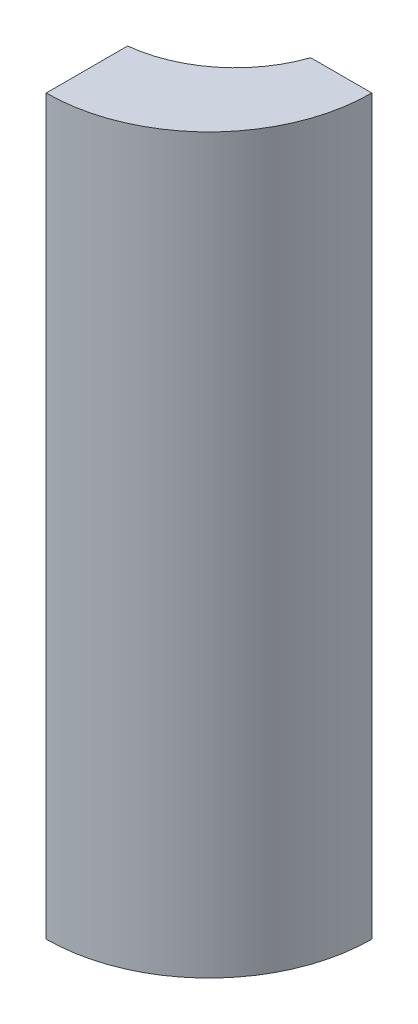
ISO-10303-21;
HEADER;
FILE_DESCRIPTION(('STEP AP214'),'2;1');
FILE_NAME('part.step','',(''),(''),'','','');
FILE_SCHEMA(('AUTOMOTIVE_DESIGN { 1 0 10303 214 1 1 1 1 }'));
ENDSEC;
DATA;
#1=APPLICATION_CONTEXT('core data for automotive mechanical design processes');
#2=APPLICATION_PROTOCOL_DEFINITION('international standard','automotive_design',2000,#1);
#3=PRODUCT_CONTEXT('',#1,'mechanical');
#4=PRODUCT('Part','Part','',(#3));
#5=PRODUCT_RELATED_PRODUCT_CATEGORY('part','',(#4));
#6=PRODUCT_DEFINITION_FORMATION('','',#4);
#7=PRODUCT_DEFINITION_CONTEXT('part definition',#1,'design');
#8=PRODUCT_DEFINITION('design','',#6,#7);
#9=PRODUCT_DEFINITION_SHAPE('','',#8);
#10=(LENGTH_UNIT() NAMED_UNIT(*) SI_UNIT(.MILLI.,.METRE.));
#11=(NAMED_UNIT(*) PLANE_ANGLE_UNIT() SI_UNIT($,.RADIAN.));
#12=(NAMED_UNIT(*) SI_UNIT($,.STERADIAN.) SOLID_ANGLE_UNIT());
#13=UNCERTAINTY_MEASURE_WITH_UNIT(LENGTH_MEASURE(1.E-05),#10,'distance_accuracy_value','');
#14=(GEOMETRIC_REPRESENTATION_CONTEXT(3) GLOBAL_UNCERTAINTY_ASSIGNED_CONTEXT((#13)) GLOBAL_UNIT_ASSIGNED_CONTEXT((#10,
#11,#12)) REPRESENTATION_CONTEXT('',''));
#15=CARTESIAN_POINT('',(0.,0.,0.));
#16=DIRECTION('',(0.,0.,1.));
#17=DIRECTION('',(1.,0.,0.));
#18=AXIS2_PLACEMENT_3D('',#15,#16,#17);
#19=CARTESIAN_POINT('',(-127.,57.15,12.7));
#20=DIRECTION('',(0.,-1.,0.));
#21=DIRECTION('',(0.,0.,-1.));
#22=AXIS2_PLACEMENT_3D('',#19,#20,#21);
#23=PLANE('',#22);
#24=CARTESIAN_POINT('',(124.872809850528,57.15,-18.93086268684));
#25=DIRECTION('',(0.,-1.,0.));
#26=DIRECTION('',(0.,0.,-1.));
#27=AXIS2_PLACEMENT_3D('',#24,#25,#26);
#28=CIRCLE('',#27,19.05);
#29=CARTESIAN_POINT('',(142.875,57.15,-12.7));
#30=VERTEX_POINT('',#29);
#31=CARTESIAN_POINT('',(127.,57.15,0.));
#32=VERTEX_POINT('',#31);
#33=EDGE_CURVE('E86',#30,#32,#28,.T.);
#34=ORIENTED_EDGE('',*,*,#33,.T.);
#35=DIRECTION('',(0.,0.,-1.));
#36=VECTOR('',#35,1.);
#37=CARTESIAN_POINT('',(127.,57.15,12.7));
#38=LINE('',#37,#36);
#39=CARTESIAN_POINT('',(127.,57.15,12.7));
#40=VERTEX_POINT('',#39);
#41=EDGE_CURVE('E75',#40,#32,#38,.T.);
#42=ORIENTED_EDGE('',*,*,#41,.F.);
#43=CARTESIAN_POINT('',(127.,57.15,-12.7));
#44=DIRECTION('',(0.,1.,0.));
#45=DIRECTION('',(0.,0.,-1.));
#46=AXIS2_PLACEMENT_3D('',#43,#44,#45);
#47=CIRCLE('',#46,25.4000000000001);
#48=CARTESIAN_POINT('',(152.4,57.15,-12.7));
#49=VERTEX_POINT('',#48);
#50=EDGE_CURVE('E84',#40,#49,#47,.T.);
#51=ORIENTED_EDGE('',*,*,#50,.T.);
#52=DIRECTION('',(1.,0.,0.));
#53=VECTOR('',#52,1.);
#54=CARTESIAN_POINT('',(142.875,57.15,-12.7));
#55=LINE('',#54,#53);
#56=EDGE_CURVE('E58',#30,#49,#55,.T.);
#57=ORIENTED_EDGE('',*,*,#56,.F.);
#58=EDGE_LOOP('',(#34,#42,#51,#57));
#59=FACE_BOUND('',#58,.T.);
#60=ADVANCED_FACE('F37',(#59),#23,.F.);
#61=CARTESIAN_POINT('',(-127.,-57.15,12.7));
#62=DIRECTION('',(0.,1.,0.));
#63=DIRECTION('',(0.,0.,1.));
#64=AXIS2_PLACEMENT_3D('',#61,#62,#63);
#65=PLANE('',#64);
#66=CARTESIAN_POINT('',(127.,-57.15,-12.7));
#67=DIRECTION('',(0.,1.,0.));
#68=DIRECTION('',(0.,0.,-1.));
#69=AXIS2_PLACEMENT_3D('',#66,#67,#68);
#70=CIRCLE('',#69,25.4000000000001);
#71=CARTESIAN_POINT('',(127.,-57.15,12.7));
#72=VERTEX_POINT('',#71);
#73=CARTESIAN_POINT('',(152.4,-57.15,-12.7));
#74=VERTEX_POINT('',#73);
#75=EDGE_CURVE('E93',#72,#74,#70,.T.);
#76=ORIENTED_EDGE('',*,*,#75,.F.);
#77=DIRECTION('',(0.,0.,1.));
#78=VECTOR('',#77,1.);
#79=CARTESIAN_POINT('',(127.,-57.15,12.7));
#80=LINE('',#79,#78);
#81=CARTESIAN_POINT('',(127.,-57.1500000000001,0.));
#82=VERTEX_POINT('',#81);
#83=EDGE_CURVE('E50',#82,#72,#80,.T.);
#84=ORIENTED_EDGE('',*,*,#83,.F.);
#85=CARTESIAN_POINT('',(124.872809850528,-57.15,-18.93086268684));
#86=DIRECTION('',(0.,-1.,0.));
#87=DIRECTION('',(0.,0.,-1.));
#88=AXIS2_PLACEMENT_3D('',#85,#86,#87);
#89=CIRCLE('',#88,19.05);
#90=CARTESIAN_POINT('',(142.875,-57.15,-12.7));
#91=VERTEX_POINT('',#90);
#92=EDGE_CURVE('E90',#91,#82,#89,.T.);
#93=ORIENTED_EDGE('',*,*,#92,.F.);
#94=DIRECTION('',(-1.,0.,0.));
#95=VECTOR('',#94,1.);
#96=CARTESIAN_POINT('',(142.875,-57.15,-12.7));
#97=LINE('',#96,#95);
#98=EDGE_CURVE('E101',#74,#91,#97,.T.);
#99=ORIENTED_EDGE('',*,*,#98,.F.);
#100=EDGE_LOOP('',(#76,#84,#93,#99));
#101=FACE_BOUND('',#100,.T.);
#102=ADVANCED_FACE('F111',(#101),#65,.F.);
#103=CARTESIAN_POINT('',(124.872809850528,-57.15,-18.93086268684));
#104=DIRECTION('',(0.,1.,0.));
#105=DIRECTION('',(0.,0.,1.));
#106=AXIS2_PLACEMENT_3D('',#103,#104,#105);
#107=CYLINDRICAL_SURFACE('',#106,19.05);
#108=ORIENTED_EDGE('',*,*,#33,.F.);
#109=DIRECTION('',(0.,1.,0.));
#110=VECTOR('',#109,1.);
#111=CARTESIAN_POINT('',(142.875,-57.15,-12.7));
#112=LINE('',#111,#110);
#113=EDGE_CURVE('E98',#91,#30,#112,.T.);
#114=ORIENTED_EDGE('',*,*,#113,.F.);
#115=ORIENTED_EDGE('',*,*,#92,.T.);
#116=DIRECTION('',(0.,1.,0.));
#117=VECTOR('',#116,1.);
#118=CARTESIAN_POINT('',(127.,-57.15,0.));
#119=LINE('',#118,#117);
#120=EDGE_CURVE('E40',#82,#32,#119,.T.);
#121=ORIENTED_EDGE('',*,*,#120,.T.);
#122=EDGE_LOOP('',(#108,#114,#115,#121));
#123=FACE_BOUND('',#122,.T.);
#124=ADVANCED_FACE('F110',(#123),#107,.F.);
#125=CARTESIAN_POINT('',(127.,-57.15,-12.7));
#126=DIRECTION('',(0.,1.,0.));
#127=DIRECTION('',(0.,0.,1.));
#128=AXIS2_PLACEMENT_3D('',#125,#126,#127);
#129=CYLINDRICAL_SURFACE('',#128,25.4000000000001);
#130=ORIENTED_EDGE('',*,*,#50,.F.);
#131=DIRECTION('',(0.,1.,0.));
#132=VECTOR('',#131,1.);
#133=CARTESIAN_POINT('',(127.,-57.15,12.7));
#134=LINE('',#133,#132);
#135=EDGE_CURVE('E11',#72,#40,#134,.T.);
#136=ORIENTED_EDGE('',*,*,#135,.F.);
#137=ORIENTED_EDGE('',*,*,#75,.T.);
#138=DIRECTION('',(0.,1.,0.));
#139=VECTOR('',#138,1.);
#140=CARTESIAN_POINT('',(152.4,-57.15,-12.7));
#141=LINE('',#140,#139);
#142=EDGE_CURVE('E89',#74,#49,#141,.T.);
#143=ORIENTED_EDGE('',*,*,#142,.T.);
#144=EDGE_LOOP('',(#130,#136,#137,#143));
#145=FACE_BOUND('',#144,.T.);
#146=ADVANCED_FACE('F88',(#145),#129,.T.);
#147=CARTESIAN_POINT('',(142.875,-311.46730181016,-12.7));
#148=DIRECTION('',(0.,0.,1.));
#149=DIRECTION('',(1.,0.,0.));
#150=AXIS2_PLACEMENT_3D('',#147,#148,#149);
#151=PLANE('',#150);
#152=ORIENTED_EDGE('',*,*,#98,.T.);
#153=ORIENTED_EDGE('',*,*,#113,.T.);
#154=ORIENTED_EDGE('',*,*,#56,.T.);
#155=ORIENTED_EDGE('',*,*,#142,.F.);
#156=EDGE_LOOP('',(#152,#153,#154,#155));
#157=FACE_BOUND('',#156,.T.);
#158=ADVANCED_FACE('F106',(#157),#151,.F.);
#159=CARTESIAN_POINT('',(127.,-311.46730181016,12.7));
#160=DIRECTION('',(1.,0.,0.));
#161=DIRECTION('',(0.,0.,-1.));
#162=AXIS2_PLACEMENT_3D('',#159,#160,#161);
#163=PLANE('',#162);
#164=ORIENTED_EDGE('',*,*,#83,.T.);
#165=ORIENTED_EDGE('',*,*,#135,.T.);
#166=ORIENTED_EDGE('',*,*,#41,.T.);
#167=ORIENTED_EDGE('',*,*,#120,.F.);
#168=EDGE_LOOP('',(#164,#165,#166,#167));
#169=FACE_BOUND('',#168,.T.);
#170=ADVANCED_FACE('F74',(#169),#163,.F.);
#171=CLOSED_SHELL('',(#60,#102,#124,#146,#158,#170));
#172=MANIFOLD_SOLID_BREP('B2',#171);
#173=ADVANCED_BREP_SHAPE_REPRESENTATION('',(#18,#172),#14);
#174=SHAPE_DEFINITION_REPRESENTATION(#9,#173);
ENDSEC;
END-ISO-10303-21;
